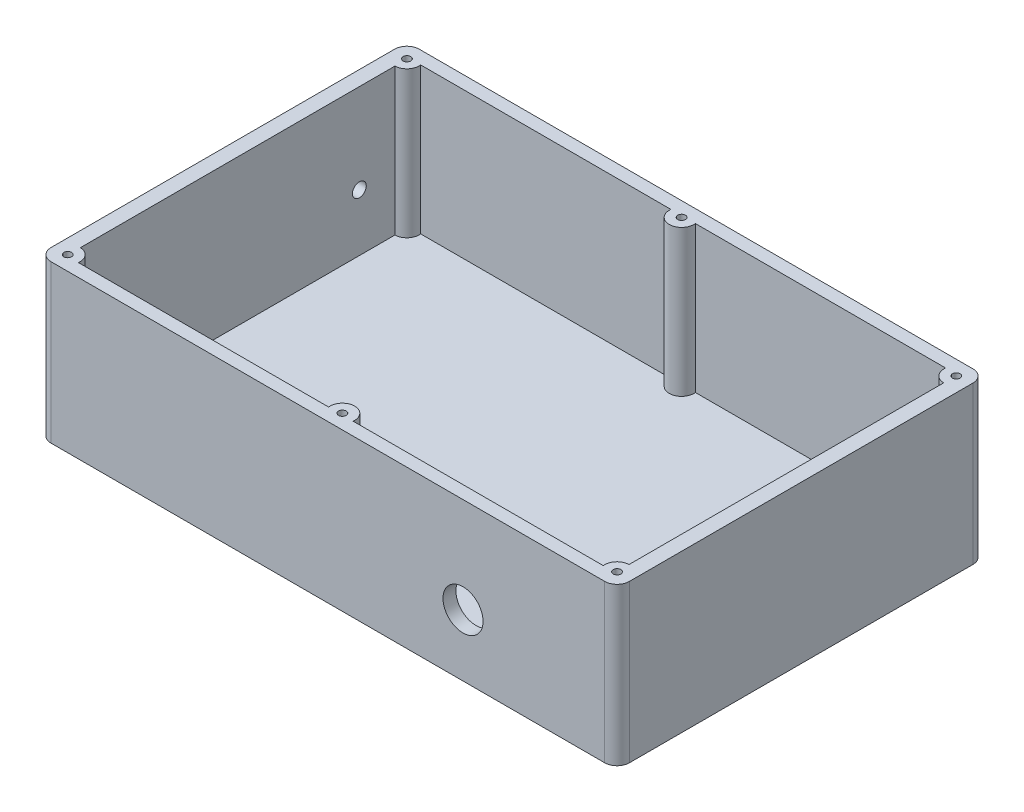
ISO-10303-21;
HEADER;
FILE_DESCRIPTION(('STEP AP214'),'2;1');
FILE_NAME('part.step','',(''),(''),'','','');
FILE_SCHEMA(('AUTOMOTIVE_DESIGN { 1 0 10303 214 1 1 1 1 }'));
ENDSEC;
DATA;
#1=APPLICATION_CONTEXT('core data for automotive mechanical design processes');
#2=APPLICATION_PROTOCOL_DEFINITION('international standard','automotive_design',2000,#1);
#3=PRODUCT_CONTEXT('',#1,'mechanical');
#4=PRODUCT('Part','Part','',(#3));
#5=PRODUCT_RELATED_PRODUCT_CATEGORY('part','',(#4));
#6=PRODUCT_DEFINITION_FORMATION('','',#4);
#7=PRODUCT_DEFINITION_CONTEXT('part definition',#1,'design');
#8=PRODUCT_DEFINITION('design','',#6,#7);
#9=PRODUCT_DEFINITION_SHAPE('','',#8);
#10=(LENGTH_UNIT() NAMED_UNIT(*) SI_UNIT(.MILLI.,.METRE.));
#11=(NAMED_UNIT(*) PLANE_ANGLE_UNIT() SI_UNIT($,.RADIAN.));
#12=(NAMED_UNIT(*) SI_UNIT($,.STERADIAN.) SOLID_ANGLE_UNIT());
#13=UNCERTAINTY_MEASURE_WITH_UNIT(LENGTH_MEASURE(1.E-05),#10,'distance_accuracy_value','');
#14=(GEOMETRIC_REPRESENTATION_CONTEXT(3) GLOBAL_UNCERTAINTY_ASSIGNED_CONTEXT((#13)) GLOBAL_UNIT_ASSIGNED_CONTEXT((#10,
#11,#12)) REPRESENTATION_CONTEXT('',''));
#15=CARTESIAN_POINT('',(0.,0.,0.));
#16=DIRECTION('',(0.,0.,1.));
#17=DIRECTION('',(1.,0.,0.));
#18=AXIS2_PLACEMENT_3D('',#15,#16,#17);
#19=CARTESIAN_POINT('',(-89.85,51.,55.75));
#20=DIRECTION('',(0.,-1.,0.));
#21=DIRECTION('',(0.,0.,-1.));
#22=AXIS2_PLACEMENT_3D('',#19,#20,#21);
#23=CYLINDRICAL_SURFACE('',#22,4.);
#24=CARTESIAN_POINT('',(-89.85,0.,55.75));
#25=DIRECTION('',(0.,1.,0.));
#26=DIRECTION('',(0.,0.,1.));
#27=AXIS2_PLACEMENT_3D('',#24,#25,#26);
#28=CIRCLE('',#27,4.);
#29=CARTESIAN_POINT('',(-93.85,0.,55.75));
#30=VERTEX_POINT('',#29);
#31=CARTESIAN_POINT('',(-89.85,0.,59.75));
#32=VERTEX_POINT('',#31);
#33=EDGE_CURVE('E141',#30,#32,#28,.T.);
#34=ORIENTED_EDGE('',*,*,#33,.T.);
#35=DIRECTION('',(0.,-1.,0.));
#36=VECTOR('',#35,1.);
#37=CARTESIAN_POINT('',(-89.85,51.,59.75));
#38=LINE('',#37,#36);
#39=CARTESIAN_POINT('',(-89.85,51.,59.75));
#40=VERTEX_POINT('',#39);
#41=EDGE_CURVE('E11',#40,#32,#38,.T.);
#42=ORIENTED_EDGE('',*,*,#41,.F.);
#43=CARTESIAN_POINT('',(-89.85,51.,55.75));
#44=DIRECTION('',(0.,1.,0.));
#45=DIRECTION('',(0.,0.,1.));
#46=AXIS2_PLACEMENT_3D('',#43,#44,#45);
#47=CIRCLE('',#46,4.);
#48=CARTESIAN_POINT('',(-93.85,51.,55.75));
#49=VERTEX_POINT('',#48);
#50=EDGE_CURVE('E157',#49,#40,#47,.T.);
#51=ORIENTED_EDGE('',*,*,#50,.F.);
#52=DIRECTION('',(0.,-1.,0.));
#53=VECTOR('',#52,1.);
#54=CARTESIAN_POINT('',(-93.85,51.,55.75));
#55=LINE('',#54,#53);
#56=EDGE_CURVE('E137',#49,#30,#55,.T.);
#57=ORIENTED_EDGE('',*,*,#56,.T.);
#58=EDGE_LOOP('',(#34,#42,#51,#57));
#59=FACE_BOUND('',#58,.T.);
#60=ADVANCED_FACE('F33',(#59),#23,.T.);
#61=CARTESIAN_POINT('',(-89.85,51.,59.75));
#62=DIRECTION('',(0.,0.,-1.));
#63=DIRECTION('',(-1.,0.,0.));
#64=AXIS2_PLACEMENT_3D('',#61,#62,#63);
#65=PLANE('',#64);
#66=CARTESIAN_POINT('',(43.85,20.,59.75));
#67=DIRECTION('',(0.,0.,1.));
#68=DIRECTION('',(1.,0.,0.));
#69=AXIS2_PLACEMENT_3D('',#66,#67,#68);
#70=CIRCLE('',#69,6.5);
#71=CARTESIAN_POINT('',(50.35,20.,59.75));
#72=VERTEX_POINT('',#71);
#73=EDGE_CURVE('E344',#72,#72,#70,.T.);
#74=ORIENTED_EDGE('',*,*,#73,.F.);
#75=EDGE_LOOP('',(#74));
#76=FACE_BOUND('',#75,.T.);
#77=DIRECTION('',(1.,0.,0.));
#78=VECTOR('',#77,1.);
#79=CARTESIAN_POINT('',(-89.85,0.,59.75));
#80=LINE('',#79,#78);
#81=CARTESIAN_POINT('',(89.85,0.,59.75));
#82=VERTEX_POINT('',#81);
#83=EDGE_CURVE('E144',#32,#82,#80,.T.);
#84=ORIENTED_EDGE('',*,*,#83,.T.);
#85=DIRECTION('',(0.,-1.,0.));
#86=VECTOR('',#85,1.);
#87=CARTESIAN_POINT('',(89.85,51.,59.75));
#88=LINE('',#87,#86);
#89=CARTESIAN_POINT('',(89.85,51.,59.75));
#90=VERTEX_POINT('',#89);
#91=EDGE_CURVE('E40',#90,#82,#88,.T.);
#92=ORIENTED_EDGE('',*,*,#91,.F.);
#93=DIRECTION('',(1.,0.,0.));
#94=VECTOR('',#93,1.);
#95=CARTESIAN_POINT('',(-89.85,51.,59.75));
#96=LINE('',#95,#94);
#97=EDGE_CURVE('E97',#40,#90,#96,.T.);
#98=ORIENTED_EDGE('',*,*,#97,.F.);
#99=ORIENTED_EDGE('',*,*,#41,.T.);
#100=EDGE_LOOP('',(#84,#92,#98,#99));
#101=FACE_BOUND('',#100,.T.);
#102=ADVANCED_FACE('F350',(#76,#101),#65,.F.);
#103=CARTESIAN_POINT('',(89.85,51.,55.75));
#104=DIRECTION('',(0.,-1.,0.));
#105=DIRECTION('',(0.,0.,-1.));
#106=AXIS2_PLACEMENT_3D('',#103,#104,#105);
#107=CYLINDRICAL_SURFACE('',#106,4.00000000000002);
#108=CARTESIAN_POINT('',(89.85,0.,55.75));
#109=DIRECTION('',(0.,1.,0.));
#110=DIRECTION('',(0.,0.,1.));
#111=AXIS2_PLACEMENT_3D('',#108,#109,#110);
#112=CIRCLE('',#111,4.00000000000002);
#113=CARTESIAN_POINT('',(93.85,0.,55.75));
#114=VERTEX_POINT('',#113);
#115=EDGE_CURVE('E147',#82,#114,#112,.T.);
#116=ORIENTED_EDGE('',*,*,#115,.T.);
#117=DIRECTION('',(0.,-1.,0.));
#118=VECTOR('',#117,1.);
#119=CARTESIAN_POINT('',(93.85,51.,55.75));
#120=LINE('',#119,#118);
#121=CARTESIAN_POINT('',(93.85,51.,55.75));
#122=VERTEX_POINT('',#121);
#123=EDGE_CURVE('E164',#122,#114,#120,.T.);
#124=ORIENTED_EDGE('',*,*,#123,.F.);
#125=CARTESIAN_POINT('',(89.85,51.,55.75));
#126=DIRECTION('',(0.,1.,0.));
#127=DIRECTION('',(0.,0.,1.));
#128=AXIS2_PLACEMENT_3D('',#125,#126,#127);
#129=CIRCLE('',#128,4.00000000000002);
#130=EDGE_CURVE('E172',#90,#122,#129,.T.);
#131=ORIENTED_EDGE('',*,*,#130,.F.);
#132=ORIENTED_EDGE('',*,*,#91,.T.);
#133=EDGE_LOOP('',(#116,#124,#131,#132));
#134=FACE_BOUND('',#133,.T.);
#135=ADVANCED_FACE('F170',(#134),#107,.T.);
#136=CARTESIAN_POINT('',(93.85,51.,-55.75));
#137=DIRECTION('',(-1.,0.,0.));
#138=DIRECTION('',(0.,0.,1.));
#139=AXIS2_PLACEMENT_3D('',#136,#137,#138);
#140=PLANE('',#139);
#141=DIRECTION('',(0.,0.,-1.));
#142=VECTOR('',#141,1.);
#143=CARTESIAN_POINT('',(93.85,0.,-55.75));
#144=LINE('',#143,#142);
#145=CARTESIAN_POINT('',(93.85,0.,-55.75));
#146=VERTEX_POINT('',#145);
#147=EDGE_CURVE('E149',#114,#146,#144,.T.);
#148=ORIENTED_EDGE('',*,*,#147,.T.);
#149=DIRECTION('',(0.,-1.,0.));
#150=VECTOR('',#149,1.);
#151=CARTESIAN_POINT('',(93.85,51.,-55.75));
#152=LINE('',#151,#150);
#153=CARTESIAN_POINT('',(93.85,51.,-55.75));
#154=VERTEX_POINT('',#153);
#155=EDGE_CURVE('E161',#154,#146,#152,.T.);
#156=ORIENTED_EDGE('',*,*,#155,.F.);
#157=DIRECTION('',(0.,0.,-1.));
#158=VECTOR('',#157,1.);
#159=CARTESIAN_POINT('',(93.85,51.,-55.75));
#160=LINE('',#159,#158);
#161=EDGE_CURVE('E184',#122,#154,#160,.T.);
#162=ORIENTED_EDGE('',*,*,#161,.F.);
#163=ORIENTED_EDGE('',*,*,#123,.T.);
#164=EDGE_LOOP('',(#148,#156,#162,#163));
#165=FACE_BOUND('',#164,.T.);
#166=ADVANCED_FACE('F180',(#165),#140,.F.);
#167=CARTESIAN_POINT('',(89.85,51.,-55.75));
#168=DIRECTION('',(0.,-1.,0.));
#169=DIRECTION('',(0.,0.,-1.));
#170=AXIS2_PLACEMENT_3D('',#167,#168,#169);
#171=CYLINDRICAL_SURFACE('',#170,4.00000000000001);
#172=CARTESIAN_POINT('',(89.85,0.,-55.75));
#173=DIRECTION('',(0.,1.,0.));
#174=DIRECTION('',(0.,0.,1.));
#175=AXIS2_PLACEMENT_3D('',#172,#173,#174);
#176=CIRCLE('',#175,4.00000000000001);
#177=CARTESIAN_POINT('',(89.85,0.,-59.75));
#178=VERTEX_POINT('',#177);
#179=EDGE_CURVE('E151',#146,#178,#176,.T.);
#180=ORIENTED_EDGE('',*,*,#179,.T.);
#181=DIRECTION('',(0.,-1.,0.));
#182=VECTOR('',#181,1.);
#183=CARTESIAN_POINT('',(89.85,51.,-59.75));
#184=LINE('',#183,#182);
#185=CARTESIAN_POINT('',(89.85,51.,-59.75));
#186=VERTEX_POINT('',#185);
#187=EDGE_CURVE('E132',#186,#178,#184,.T.);
#188=ORIENTED_EDGE('',*,*,#187,.F.);
#189=CARTESIAN_POINT('',(89.85,51.,-55.75));
#190=DIRECTION('',(0.,1.,0.));
#191=DIRECTION('',(0.,0.,1.));
#192=AXIS2_PLACEMENT_3D('',#189,#190,#191);
#193=CIRCLE('',#192,4.00000000000001);
#194=EDGE_CURVE('E120',#154,#186,#193,.T.);
#195=ORIENTED_EDGE('',*,*,#194,.F.);
#196=ORIENTED_EDGE('',*,*,#155,.T.);
#197=EDGE_LOOP('',(#180,#188,#195,#196));
#198=FACE_BOUND('',#197,.T.);
#199=ADVANCED_FACE('F183',(#198),#171,.T.);
#200=CARTESIAN_POINT('',(-89.85,51.,-59.75));
#201=DIRECTION('',(0.,0.,1.));
#202=DIRECTION('',(1.,0.,0.));
#203=AXIS2_PLACEMENT_3D('',#200,#201,#202);
#204=PLANE('',#203);
#205=DIRECTION('',(-1.,0.,0.));
#206=VECTOR('',#205,1.);
#207=CARTESIAN_POINT('',(-89.85,0.,-59.75));
#208=LINE('',#207,#206);
#209=CARTESIAN_POINT('',(-89.85,0.,-59.75));
#210=VERTEX_POINT('',#209);
#211=EDGE_CURVE('E129',#178,#210,#208,.T.);
#212=ORIENTED_EDGE('',*,*,#211,.T.);
#213=DIRECTION('',(0.,-1.,0.));
#214=VECTOR('',#213,1.);
#215=CARTESIAN_POINT('',(-89.85,51.,-59.75));
#216=LINE('',#215,#214);
#217=CARTESIAN_POINT('',(-89.85,51.,-59.75));
#218=VERTEX_POINT('',#217);
#219=EDGE_CURVE('E126',#218,#210,#216,.T.);
#220=ORIENTED_EDGE('',*,*,#219,.F.);
#221=DIRECTION('',(-1.,0.,0.));
#222=VECTOR('',#221,1.);
#223=CARTESIAN_POINT('',(-89.85,51.,-59.75));
#224=LINE('',#223,#222);
#225=EDGE_CURVE('E113',#186,#218,#224,.T.);
#226=ORIENTED_EDGE('',*,*,#225,.F.);
#227=ORIENTED_EDGE('',*,*,#187,.T.);
#228=EDGE_LOOP('',(#212,#220,#226,#227));
#229=FACE_BOUND('',#228,.T.);
#230=ADVANCED_FACE('F127',(#229),#204,.F.);
#231=CARTESIAN_POINT('',(-89.85,51.,-55.75));
#232=DIRECTION('',(0.,-1.,0.));
#233=DIRECTION('',(0.,0.,-1.));
#234=AXIS2_PLACEMENT_3D('',#231,#232,#233);
#235=CYLINDRICAL_SURFACE('',#234,4.);
#236=CARTESIAN_POINT('',(-89.85,0.,-55.75));
#237=DIRECTION('',(0.,1.,0.));
#238=DIRECTION('',(0.,0.,1.));
#239=AXIS2_PLACEMENT_3D('',#236,#237,#238);
#240=CIRCLE('',#239,4.);
#241=CARTESIAN_POINT('',(-93.85,0.,-55.75));
#242=VERTEX_POINT('',#241);
#243=EDGE_CURVE('E154',#210,#242,#240,.T.);
#244=ORIENTED_EDGE('',*,*,#243,.T.);
#245=DIRECTION('',(0.,-1.,0.));
#246=VECTOR('',#245,1.);
#247=CARTESIAN_POINT('',(-93.85,51.,-55.75));
#248=LINE('',#247,#246);
#249=CARTESIAN_POINT('',(-93.85,51.,-55.75));
#250=VERTEX_POINT('',#249);
#251=EDGE_CURVE('E133',#250,#242,#248,.T.);
#252=ORIENTED_EDGE('',*,*,#251,.F.);
#253=CARTESIAN_POINT('',(-89.85,51.,-55.75));
#254=DIRECTION('',(0.,1.,0.));
#255=DIRECTION('',(0.,0.,1.));
#256=AXIS2_PLACEMENT_3D('',#253,#254,#255);
#257=CIRCLE('',#256,4.);
#258=EDGE_CURVE('E117',#218,#250,#257,.T.);
#259=ORIENTED_EDGE('',*,*,#258,.F.);
#260=ORIENTED_EDGE('',*,*,#219,.T.);
#261=EDGE_LOOP('',(#244,#252,#259,#260));
#262=FACE_BOUND('',#261,.T.);
#263=ADVANCED_FACE('F135',(#262),#235,.T.);
#264=CARTESIAN_POINT('',(-93.85,51.,-55.75));
#265=DIRECTION('',(1.,0.,0.));
#266=DIRECTION('',(0.,0.,-1.));
#267=AXIS2_PLACEMENT_3D('',#264,#265,#266);
#268=PLANE('',#267);
#269=CARTESIAN_POINT('',(-93.85,22.,-39.5));
#270=DIRECTION('',(-1.,0.,0.));
#271=DIRECTION('',(0.,0.,1.));
#272=AXIS2_PLACEMENT_3D('',#269,#270,#271);
#273=CIRCLE('',#272,2.24999999999999);
#274=CARTESIAN_POINT('',(-93.85,22.,-37.25));
#275=VERTEX_POINT('',#274);
#276=EDGE_CURVE('E338',#275,#275,#273,.T.);
#277=ORIENTED_EDGE('',*,*,#276,.F.);
#278=EDGE_LOOP('',(#277));
#279=FACE_BOUND('',#278,.T.);
#280=CARTESIAN_POINT('',(-93.85,22.,39.5));
#281=DIRECTION('',(-1.,0.,0.));
#282=DIRECTION('',(0.,0.,1.));
#283=AXIS2_PLACEMENT_3D('',#280,#281,#282);
#284=CIRCLE('',#283,2.24999999999999);
#285=CARTESIAN_POINT('',(-93.85,22.,41.75));
#286=VERTEX_POINT('',#285);
#287=EDGE_CURVE('E332',#286,#286,#284,.T.);
#288=ORIENTED_EDGE('',*,*,#287,.F.);
#289=EDGE_LOOP('',(#288));
#290=FACE_BOUND('',#289,.T.);
#291=DIRECTION('',(0.,0.,1.));
#292=VECTOR('',#291,1.);
#293=CARTESIAN_POINT('',(-93.85,0.,-55.75));
#294=LINE('',#293,#292);
#295=EDGE_CURVE('E89',#242,#30,#294,.T.);
#296=ORIENTED_EDGE('',*,*,#295,.T.);
#297=ORIENTED_EDGE('',*,*,#56,.F.);
#298=DIRECTION('',(0.,0.,1.));
#299=VECTOR('',#298,1.);
#300=CARTESIAN_POINT('',(-93.85,51.,-55.75));
#301=LINE('',#300,#299);
#302=EDGE_CURVE('E56',#250,#49,#301,.T.);
#303=ORIENTED_EDGE('',*,*,#302,.F.);
#304=ORIENTED_EDGE('',*,*,#251,.T.);
#305=EDGE_LOOP('',(#296,#297,#303,#304));
#306=FACE_BOUND('',#305,.T.);
#307=ADVANCED_FACE('F355',(#279,#290,#306),#268,.F.);
#308=CARTESIAN_POINT('',(-89.85,51.,55.75));
#309=DIRECTION('',(0.,1.,0.));
#310=DIRECTION('',(0.,0.,1.));
#311=AXIS2_PLACEMENT_3D('',#308,#309,#310);
#312=PLANE('',#311);
#313=CARTESIAN_POINT('',(-89.15,51.,-55.05));
#314=DIRECTION('',(0.,1.,0.));
#315=DIRECTION('',(0.,0.,1.));
#316=AXIS2_PLACEMENT_3D('',#313,#314,#315);
#317=CIRCLE('',#316,1.24999999999999);
#318=CARTESIAN_POINT('',(-89.15,51.,-53.8));
#319=VERTEX_POINT('',#318);
#320=EDGE_CURVE('E326',#319,#319,#317,.T.);
#321=ORIENTED_EDGE('',*,*,#320,.F.);
#322=EDGE_LOOP('',(#321));
#323=FACE_BOUND('',#322,.T.);
#324=CARTESIAN_POINT('',(-89.15,51.,55.05));
#325=DIRECTION('',(0.,1.,0.));
#326=DIRECTION('',(0.,0.,1.));
#327=AXIS2_PLACEMENT_3D('',#324,#325,#326);
#328=CIRCLE('',#327,1.24999999999999);
#329=CARTESIAN_POINT('',(-89.15,51.,56.3));
#330=VERTEX_POINT('',#329);
#331=EDGE_CURVE('E320',#330,#330,#328,.T.);
#332=ORIENTED_EDGE('',*,*,#331,.F.);
#333=EDGE_LOOP('',(#332));
#334=FACE_BOUND('',#333,.T.);
#335=CARTESIAN_POINT('',(89.1500000000001,51.,55.05));
#336=DIRECTION('',(0.,1.,0.));
#337=DIRECTION('',(0.,0.,1.));
#338=AXIS2_PLACEMENT_3D('',#335,#336,#337);
#339=CIRCLE('',#338,1.24999999999999);
#340=CARTESIAN_POINT('',(89.1500000000001,51.,56.3));
#341=VERTEX_POINT('',#340);
#342=EDGE_CURVE('E314',#341,#341,#339,.T.);
#343=ORIENTED_EDGE('',*,*,#342,.F.);
#344=EDGE_LOOP('',(#343));
#345=FACE_BOUND('',#344,.T.);
#346=CARTESIAN_POINT('',(89.15,51.,-55.05));
#347=DIRECTION('',(0.,1.,0.));
#348=DIRECTION('',(0.,0.,1.));
#349=AXIS2_PLACEMENT_3D('',#346,#347,#348);
#350=CIRCLE('',#349,1.24999999999999);
#351=CARTESIAN_POINT('',(89.15,51.,-53.8000000000001));
#352=VERTEX_POINT('',#351);
#353=EDGE_CURVE('E308',#352,#352,#350,.T.);
#354=ORIENTED_EDGE('',*,*,#353,.F.);
#355=EDGE_LOOP('',(#354));
#356=FACE_BOUND('',#355,.T.);
#357=CARTESIAN_POINT('',(0.,51.,55.05));
#358=DIRECTION('',(0.,1.,0.));
#359=DIRECTION('',(0.,0.,1.));
#360=AXIS2_PLACEMENT_3D('',#357,#358,#359);
#361=CIRCLE('',#360,1.24999999999999);
#362=CARTESIAN_POINT('',(0.,51.,56.3));
#363=VERTEX_POINT('',#362);
#364=EDGE_CURVE('E302',#363,#363,#361,.T.);
#365=ORIENTED_EDGE('',*,*,#364,.F.);
#366=EDGE_LOOP('',(#365));
#367=FACE_BOUND('',#366,.T.);
#368=CARTESIAN_POINT('',(0.,51.,-55.05));
#369=DIRECTION('',(0.,1.,0.));
#370=DIRECTION('',(0.,0.,1.));
#371=AXIS2_PLACEMENT_3D('',#368,#369,#370);
#372=CIRCLE('',#371,1.24999999999999);
#373=CARTESIAN_POINT('',(0.,51.,-53.8));
#374=VERTEX_POINT('',#373);
#375=EDGE_CURVE('E296',#374,#374,#372,.T.);
#376=ORIENTED_EDGE('',*,*,#375,.F.);
#377=EDGE_LOOP('',(#376));
#378=FACE_BOUND('',#377,.T.);
#379=CARTESIAN_POINT('',(-89.15,51.,-55.05));
#380=DIRECTION('',(0.,-1.,0.));
#381=DIRECTION('',(0.,0.,-1.));
#382=AXIS2_PLACEMENT_3D('',#379,#380,#381);
#383=CIRCLE('',#382,4.);
#384=CARTESIAN_POINT('',(-85.1813730334031,51.,-55.55));
#385=VERTEX_POINT('',#384);
#386=CARTESIAN_POINT('',(-89.05,51.,-51.0512501953736));
#387=VERTEX_POINT('',#386);
#388=EDGE_CURVE('E47',#385,#387,#383,.T.);
#389=ORIENTED_EDGE('',*,*,#388,.F.);
#390=DIRECTION('',(-1.,0.,0.));
#391=VECTOR('',#390,1.);
#392=CARTESIAN_POINT('',(-3.96862696659687,51.,-55.55));
#393=LINE('',#392,#391);
#394=CARTESIAN_POINT('',(-3.96862696659687,51.,-55.55));
#395=VERTEX_POINT('',#394);
#396=EDGE_CURVE('E224',#395,#385,#393,.T.);
#397=ORIENTED_EDGE('',*,*,#396,.F.);
#398=CARTESIAN_POINT('',(0.,51.,-55.05));
#399=DIRECTION('',(0.,-1.,0.));
#400=DIRECTION('',(0.,0.,1.));
#401=AXIS2_PLACEMENT_3D('',#398,#399,#400);
#402=CIRCLE('',#401,4.);
#403=CARTESIAN_POINT('',(3.9686269665969,51.,-55.55));
#404=VERTEX_POINT('',#403);
#405=EDGE_CURVE('E228',#404,#395,#402,.T.);
#406=ORIENTED_EDGE('',*,*,#405,.F.);
#407=DIRECTION('',(-1.,0.,0.));
#408=VECTOR('',#407,1.);
#409=CARTESIAN_POINT('',(3.9686269665969,51.,-55.55));
#410=LINE('',#409,#408);
#411=CARTESIAN_POINT('',(85.1813730334031,51.,-55.55));
#412=VERTEX_POINT('',#411);
#413=EDGE_CURVE('E231',#412,#404,#410,.T.);
#414=ORIENTED_EDGE('',*,*,#413,.F.);
#415=CARTESIAN_POINT('',(89.15,51.,-55.05));
#416=DIRECTION('',(0.,-1.,0.));
#417=DIRECTION('',(0.,0.,1.));
#418=AXIS2_PLACEMENT_3D('',#415,#416,#417);
#419=CIRCLE('',#418,4.);
#420=CARTESIAN_POINT('',(89.05,51.,-51.0512501953736));
#421=VERTEX_POINT('',#420);
#422=EDGE_CURVE('E234',#421,#412,#419,.T.);
#423=ORIENTED_EDGE('',*,*,#422,.F.);
#424=DIRECTION('',(0.,0.,-1.));
#425=VECTOR('',#424,1.);
#426=CARTESIAN_POINT('',(89.05,51.,51.0512501953735));
#427=LINE('',#426,#425);
#428=CARTESIAN_POINT('',(89.05,51.,51.0512501953735));
#429=VERTEX_POINT('',#428);
#430=EDGE_CURVE('E237',#429,#421,#427,.T.);
#431=ORIENTED_EDGE('',*,*,#430,.F.);
#432=CARTESIAN_POINT('',(89.1500000000001,51.,55.05));
#433=DIRECTION('',(0.,-1.,0.));
#434=DIRECTION('',(0.,0.,-1.));
#435=AXIS2_PLACEMENT_3D('',#432,#433,#434);
#436=CIRCLE('',#435,4.);
#437=CARTESIAN_POINT('',(85.1813730334032,51.,55.55));
#438=VERTEX_POINT('',#437);
#439=EDGE_CURVE('E240',#438,#429,#436,.T.);
#440=ORIENTED_EDGE('',*,*,#439,.F.);
#441=DIRECTION('',(1.,0.,0.));
#442=VECTOR('',#441,1.);
#443=CARTESIAN_POINT('',(3.96862696659693,51.,55.55));
#444=LINE('',#443,#442);
#445=CARTESIAN_POINT('',(3.96862696659693,51.,55.55));
#446=VERTEX_POINT('',#445);
#447=EDGE_CURVE('E243',#446,#438,#444,.T.);
#448=ORIENTED_EDGE('',*,*,#447,.F.);
#449=CARTESIAN_POINT('',(0.,51.,55.05));
#450=DIRECTION('',(0.,-1.,0.));
#451=DIRECTION('',(0.,0.,-1.));
#452=AXIS2_PLACEMENT_3D('',#449,#450,#451);
#453=CIRCLE('',#452,4.);
#454=CARTESIAN_POINT('',(-3.96862696659685,51.,55.55));
#455=VERTEX_POINT('',#454);
#456=EDGE_CURVE('E246',#455,#446,#453,.T.);
#457=ORIENTED_EDGE('',*,*,#456,.F.);
#458=DIRECTION('',(1.,0.,0.));
#459=VECTOR('',#458,1.);
#460=CARTESIAN_POINT('',(-85.1813730334031,51.,55.55));
#461=LINE('',#460,#459);
#462=CARTESIAN_POINT('',(-85.1813730334031,51.,55.55));
#463=VERTEX_POINT('',#462);
#464=EDGE_CURVE('E249',#463,#455,#461,.T.);
#465=ORIENTED_EDGE('',*,*,#464,.F.);
#466=CARTESIAN_POINT('',(-89.15,51.,55.05));
#467=DIRECTION('',(0.,-1.,0.));
#468=DIRECTION('',(0.,0.,1.));
#469=AXIS2_PLACEMENT_3D('',#466,#467,#468);
#470=CIRCLE('',#469,4.);
#471=CARTESIAN_POINT('',(-89.05,51.,51.0512501953736));
#472=VERTEX_POINT('',#471);
#473=EDGE_CURVE('E252',#472,#463,#470,.T.);
#474=ORIENTED_EDGE('',*,*,#473,.F.);
#475=DIRECTION('',(0.,0.,1.));
#476=VECTOR('',#475,1.);
#477=CARTESIAN_POINT('',(-89.05,51.,-51.0512501953736));
#478=LINE('',#477,#476);
#479=EDGE_CURVE('E255',#387,#472,#478,.T.);
#480=ORIENTED_EDGE('',*,*,#479,.F.);
#481=EDGE_LOOP('',(#389,#397,#406,#414,#423,#431,#440,#448,#457,#465,#474,#480));
#482=FACE_BOUND('',#481,.T.);
#483=ORIENTED_EDGE('',*,*,#50,.T.);
#484=ORIENTED_EDGE('',*,*,#97,.T.);
#485=ORIENTED_EDGE('',*,*,#130,.T.);
#486=ORIENTED_EDGE('',*,*,#161,.T.);
#487=ORIENTED_EDGE('',*,*,#194,.T.);
#488=ORIENTED_EDGE('',*,*,#225,.T.);
#489=ORIENTED_EDGE('',*,*,#258,.T.);
#490=ORIENTED_EDGE('',*,*,#302,.T.);
#491=EDGE_LOOP('',(#483,#484,#485,#486,#487,#488,#489,#490));
#492=FACE_BOUND('',#491,.T.);
#493=ADVANCED_FACE('F115',(#323,#334,#345,#356,#367,#378,#482,#492),#312,.T.);
#494=CARTESIAN_POINT('',(-89.85,0.,55.75));
#495=DIRECTION('',(0.,1.,0.));
#496=DIRECTION('',(0.,0.,1.));
#497=AXIS2_PLACEMENT_3D('',#494,#495,#496);
#498=PLANE('',#497);
#499=ORIENTED_EDGE('',*,*,#33,.F.);
#500=ORIENTED_EDGE('',*,*,#295,.F.);
#501=ORIENTED_EDGE('',*,*,#243,.F.);
#502=ORIENTED_EDGE('',*,*,#211,.F.);
#503=ORIENTED_EDGE('',*,*,#179,.F.);
#504=ORIENTED_EDGE('',*,*,#147,.F.);
#505=ORIENTED_EDGE('',*,*,#115,.F.);
#506=ORIENTED_EDGE('',*,*,#83,.F.);
#507=EDGE_LOOP('',(#499,#500,#501,#502,#503,#504,#505,#506));
#508=FACE_BOUND('',#507,.T.);
#509=ADVANCED_FACE('F176',(#508),#498,.F.);
#510=CARTESIAN_POINT('',(-89.15,3.5,-55.05));
#511=DIRECTION('',(0.,1.,0.));
#512=DIRECTION('',(0.,0.,1.));
#513=AXIS2_PLACEMENT_3D('',#510,#511,#512);
#514=CYLINDRICAL_SURFACE('',#513,4.);
#515=ORIENTED_EDGE('',*,*,#388,.T.);
#516=DIRECTION('',(0.,1.,0.));
#517=VECTOR('',#516,1.);
#518=CARTESIAN_POINT('',(-89.05,3.5,-51.0512501953736));
#519=LINE('',#518,#517);
#520=CARTESIAN_POINT('',(-89.05,3.5,-51.0512501953736));
#521=VERTEX_POINT('',#520);
#522=EDGE_CURVE('E190',#521,#387,#519,.T.);
#523=ORIENTED_EDGE('',*,*,#522,.F.);
#524=CARTESIAN_POINT('',(-89.15,3.5,-55.05));
#525=DIRECTION('',(0.,-1.,0.));
#526=DIRECTION('',(0.,0.,-1.));
#527=AXIS2_PLACEMENT_3D('',#524,#525,#526);
#528=CIRCLE('',#527,4.);
#529=CARTESIAN_POINT('',(-85.1813730334031,3.5,-55.55));
#530=VERTEX_POINT('',#529);
#531=EDGE_CURVE('E227',#530,#521,#528,.T.);
#532=ORIENTED_EDGE('',*,*,#531,.F.);
#533=DIRECTION('',(0.,1.,0.));
#534=VECTOR('',#533,1.);
#535=CARTESIAN_POINT('',(-85.1813730334031,3.5,-55.55));
#536=LINE('',#535,#534);
#537=EDGE_CURVE('E145',#530,#385,#536,.T.);
#538=ORIENTED_EDGE('',*,*,#537,.T.);
#539=EDGE_LOOP('',(#515,#523,#532,#538));
#540=FACE_BOUND('',#539,.T.);
#541=ADVANCED_FACE('F416',(#540),#514,.T.);
#542=CARTESIAN_POINT('',(-3.96862696659687,3.5,-55.55));
#543=DIRECTION('',(0.,0.,-1.));
#544=DIRECTION('',(-1.,0.,0.));
#545=AXIS2_PLACEMENT_3D('',#542,#543,#544);
#546=PLANE('',#545);
#547=ORIENTED_EDGE('',*,*,#396,.T.);
#548=ORIENTED_EDGE('',*,*,#537,.F.);
#549=DIRECTION('',(-1.,0.,0.));
#550=VECTOR('',#549,1.);
#551=CARTESIAN_POINT('',(-3.96862696659687,3.5,-55.55));
#552=LINE('',#551,#550);
#553=CARTESIAN_POINT('',(-3.96862696659687,3.5,-55.55));
#554=VERTEX_POINT('',#553);
#555=EDGE_CURVE('E193',#554,#530,#552,.T.);
#556=ORIENTED_EDGE('',*,*,#555,.F.);
#557=DIRECTION('',(0.,1.,0.));
#558=VECTOR('',#557,1.);
#559=CARTESIAN_POINT('',(-3.96862696659687,3.5,-55.55));
#560=LINE('',#559,#558);
#561=EDGE_CURVE('E220',#554,#395,#560,.T.);
#562=ORIENTED_EDGE('',*,*,#561,.T.);
#563=EDGE_LOOP('',(#547,#548,#556,#562));
#564=FACE_BOUND('',#563,.T.);
#565=ADVANCED_FACE('F425',(#564),#546,.F.);
#566=CARTESIAN_POINT('',(0.,3.5,-55.05));
#567=DIRECTION('',(0.,1.,0.));
#568=DIRECTION('',(0.,0.,1.));
#569=AXIS2_PLACEMENT_3D('',#566,#567,#568);
#570=CYLINDRICAL_SURFACE('',#569,4.);
#571=ORIENTED_EDGE('',*,*,#405,.T.);
#572=ORIENTED_EDGE('',*,*,#561,.F.);
#573=CARTESIAN_POINT('',(0.,3.5,-55.05));
#574=DIRECTION('',(0.,-1.,0.));
#575=DIRECTION('',(0.,0.,1.));
#576=AXIS2_PLACEMENT_3D('',#573,#574,#575);
#577=CIRCLE('',#576,4.);
#578=CARTESIAN_POINT('',(3.9686269665969,3.5,-55.55));
#579=VERTEX_POINT('',#578);
#580=EDGE_CURVE('E262',#579,#554,#577,.T.);
#581=ORIENTED_EDGE('',*,*,#580,.F.);
#582=DIRECTION('',(0.,1.,0.));
#583=VECTOR('',#582,1.);
#584=CARTESIAN_POINT('',(3.9686269665969,3.5,-55.55));
#585=LINE('',#584,#583);
#586=EDGE_CURVE('E217',#579,#404,#585,.T.);
#587=ORIENTED_EDGE('',*,*,#586,.T.);
#588=EDGE_LOOP('',(#571,#572,#581,#587));
#589=FACE_BOUND('',#588,.T.);
#590=ADVANCED_FACE('F434',(#589),#570,.T.);
#591=CARTESIAN_POINT('',(3.9686269665969,3.5,-55.55));
#592=DIRECTION('',(0.,0.,-1.));
#593=DIRECTION('',(-1.,0.,0.));
#594=AXIS2_PLACEMENT_3D('',#591,#592,#593);
#595=PLANE('',#594);
#596=ORIENTED_EDGE('',*,*,#413,.T.);
#597=ORIENTED_EDGE('',*,*,#586,.F.);
#598=DIRECTION('',(-1.,0.,0.));
#599=VECTOR('',#598,1.);
#600=CARTESIAN_POINT('',(3.9686269665969,3.5,-55.55));
#601=LINE('',#600,#599);
#602=CARTESIAN_POINT('',(85.1813730334031,3.5,-55.55));
#603=VERTEX_POINT('',#602);
#604=EDGE_CURVE('E265',#603,#579,#601,.T.);
#605=ORIENTED_EDGE('',*,*,#604,.F.);
#606=DIRECTION('',(0.,1.,0.));
#607=VECTOR('',#606,1.);
#608=CARTESIAN_POINT('',(85.1813730334031,3.5,-55.55));
#609=LINE('',#608,#607);
#610=EDGE_CURVE('E214',#603,#412,#609,.T.);
#611=ORIENTED_EDGE('',*,*,#610,.T.);
#612=EDGE_LOOP('',(#596,#597,#605,#611));
#613=FACE_BOUND('',#612,.T.);
#614=ADVANCED_FACE('F444',(#613),#595,.F.);
#615=CARTESIAN_POINT('',(89.15,3.5,-55.05));
#616=DIRECTION('',(0.,1.,0.));
#617=DIRECTION('',(0.,0.,1.));
#618=AXIS2_PLACEMENT_3D('',#615,#616,#617);
#619=CYLINDRICAL_SURFACE('',#618,4.);
#620=ORIENTED_EDGE('',*,*,#422,.T.);
#621=ORIENTED_EDGE('',*,*,#610,.F.);
#622=CARTESIAN_POINT('',(89.15,3.5,-55.05));
#623=DIRECTION('',(0.,-1.,0.));
#624=DIRECTION('',(0.,0.,1.));
#625=AXIS2_PLACEMENT_3D('',#622,#623,#624);
#626=CIRCLE('',#625,4.);
#627=CARTESIAN_POINT('',(89.05,3.5,-51.0512501953736));
#628=VERTEX_POINT('',#627);
#629=EDGE_CURVE('E268',#628,#603,#626,.T.);
#630=ORIENTED_EDGE('',*,*,#629,.F.);
#631=DIRECTION('',(0.,1.,0.));
#632=VECTOR('',#631,1.);
#633=CARTESIAN_POINT('',(89.05,3.5,-51.0512501953736));
#634=LINE('',#633,#632);
#635=EDGE_CURVE('E211',#628,#421,#634,.T.);
#636=ORIENTED_EDGE('',*,*,#635,.T.);
#637=EDGE_LOOP('',(#620,#621,#630,#636));
#638=FACE_BOUND('',#637,.T.);
#639=ADVANCED_FACE('F454',(#638),#619,.T.);
#640=CARTESIAN_POINT('',(89.05,3.5,51.0512501953735));
#641=DIRECTION('',(1.,0.,0.));
#642=DIRECTION('',(0.,0.,-1.));
#643=AXIS2_PLACEMENT_3D('',#640,#641,#642);
#644=PLANE('',#643);
#645=ORIENTED_EDGE('',*,*,#430,.T.);
#646=ORIENTED_EDGE('',*,*,#635,.F.);
#647=DIRECTION('',(0.,0.,-1.));
#648=VECTOR('',#647,1.);
#649=CARTESIAN_POINT('',(89.05,3.5,51.0512501953735));
#650=LINE('',#649,#648);
#651=CARTESIAN_POINT('',(89.05,3.5,51.0512501953735));
#652=VERTEX_POINT('',#651);
#653=EDGE_CURVE('E271',#652,#628,#650,.T.);
#654=ORIENTED_EDGE('',*,*,#653,.F.);
#655=DIRECTION('',(0.,1.,0.));
#656=VECTOR('',#655,1.);
#657=CARTESIAN_POINT('',(89.05,3.5,51.0512501953735));
#658=LINE('',#657,#656);
#659=EDGE_CURVE('E208',#652,#429,#658,.T.);
#660=ORIENTED_EDGE('',*,*,#659,.T.);
#661=EDGE_LOOP('',(#645,#646,#654,#660));
#662=FACE_BOUND('',#661,.T.);
#663=ADVANCED_FACE('F464',(#662),#644,.F.);
#664=CARTESIAN_POINT('',(89.1500000000001,3.5,55.05));
#665=DIRECTION('',(0.,1.,0.));
#666=DIRECTION('',(0.,0.,1.));
#667=AXIS2_PLACEMENT_3D('',#664,#665,#666);
#668=CYLINDRICAL_SURFACE('',#667,4.);
#669=ORIENTED_EDGE('',*,*,#439,.T.);
#670=ORIENTED_EDGE('',*,*,#659,.F.);
#671=CARTESIAN_POINT('',(89.1500000000001,3.5,55.05));
#672=DIRECTION('',(0.,-1.,0.));
#673=DIRECTION('',(0.,0.,-1.));
#674=AXIS2_PLACEMENT_3D('',#671,#672,#673);
#675=CIRCLE('',#674,4.);
#676=CARTESIAN_POINT('',(85.1813730334032,3.5,55.55));
#677=VERTEX_POINT('',#676);
#678=EDGE_CURVE('E274',#677,#652,#675,.T.);
#679=ORIENTED_EDGE('',*,*,#678,.F.);
#680=DIRECTION('',(0.,1.,0.));
#681=VECTOR('',#680,1.);
#682=CARTESIAN_POINT('',(85.1813730334032,3.5,55.55));
#683=LINE('',#682,#681);
#684=EDGE_CURVE('E205',#677,#438,#683,.T.);
#685=ORIENTED_EDGE('',*,*,#684,.T.);
#686=EDGE_LOOP('',(#669,#670,#679,#685));
#687=FACE_BOUND('',#686,.T.);
#688=ADVANCED_FACE('F474',(#687),#668,.T.);
#689=CARTESIAN_POINT('',(3.96862696659693,3.5,55.55));
#690=DIRECTION('',(0.,0.,1.));
#691=DIRECTION('',(1.,0.,0.));
#692=AXIS2_PLACEMENT_3D('',#689,#690,#691);
#693=PLANE('',#692);
#694=CARTESIAN_POINT('',(43.85,20.,55.55));
#695=DIRECTION('',(0.,0.,1.));
#696=DIRECTION('',(1.,0.,0.));
#697=AXIS2_PLACEMENT_3D('',#694,#695,#696);
#698=CIRCLE('',#697,6.5);
#699=CARTESIAN_POINT('',(50.35,20.,55.55));
#700=VERTEX_POINT('',#699);
#701=EDGE_CURVE('E341',#700,#700,#698,.T.);
#702=ORIENTED_EDGE('',*,*,#701,.T.);
#703=EDGE_LOOP('',(#702));
#704=FACE_BOUND('',#703,.T.);
#705=ORIENTED_EDGE('',*,*,#447,.T.);
#706=ORIENTED_EDGE('',*,*,#684,.F.);
#707=DIRECTION('',(1.,0.,0.));
#708=VECTOR('',#707,1.);
#709=CARTESIAN_POINT('',(3.96862696659693,3.5,55.55));
#710=LINE('',#709,#708);
#711=CARTESIAN_POINT('',(3.96862696659693,3.5,55.55));
#712=VERTEX_POINT('',#711);
#713=EDGE_CURVE('E277',#712,#677,#710,.T.);
#714=ORIENTED_EDGE('',*,*,#713,.F.);
#715=DIRECTION('',(0.,1.,0.));
#716=VECTOR('',#715,1.);
#717=CARTESIAN_POINT('',(3.96862696659693,3.5,55.55));
#718=LINE('',#717,#716);
#719=EDGE_CURVE('E202',#712,#446,#718,.T.);
#720=ORIENTED_EDGE('',*,*,#719,.T.);
#721=EDGE_LOOP('',(#705,#706,#714,#720));
#722=FACE_BOUND('',#721,.T.);
#723=ADVANCED_FACE('F484',(#704,#722),#693,.F.);
#724=CARTESIAN_POINT('',(0.,3.5,55.05));
#725=DIRECTION('',(0.,1.,0.));
#726=DIRECTION('',(0.,0.,1.));
#727=AXIS2_PLACEMENT_3D('',#724,#725,#726);
#728=CYLINDRICAL_SURFACE('',#727,4.);
#729=ORIENTED_EDGE('',*,*,#456,.T.);
#730=ORIENTED_EDGE('',*,*,#719,.F.);
#731=CARTESIAN_POINT('',(0.,3.5,55.05));
#732=DIRECTION('',(0.,-1.,0.));
#733=DIRECTION('',(0.,0.,-1.));
#734=AXIS2_PLACEMENT_3D('',#731,#732,#733);
#735=CIRCLE('',#734,4.);
#736=CARTESIAN_POINT('',(-3.96862696659685,3.5,55.55));
#737=VERTEX_POINT('',#736);
#738=EDGE_CURVE('E280',#737,#712,#735,.T.);
#739=ORIENTED_EDGE('',*,*,#738,.F.);
#740=DIRECTION('',(0.,1.,0.));
#741=VECTOR('',#740,1.);
#742=CARTESIAN_POINT('',(-3.96862696659685,3.5,55.55));
#743=LINE('',#742,#741);
#744=EDGE_CURVE('E199',#737,#455,#743,.T.);
#745=ORIENTED_EDGE('',*,*,#744,.T.);
#746=EDGE_LOOP('',(#729,#730,#739,#745));
#747=FACE_BOUND('',#746,.T.);
#748=ADVANCED_FACE('F492',(#747),#728,.T.);
#749=CARTESIAN_POINT('',(-85.1813730334031,3.5,55.55));
#750=DIRECTION('',(0.,0.,1.));
#751=DIRECTION('',(1.,0.,0.));
#752=AXIS2_PLACEMENT_3D('',#749,#750,#751);
#753=PLANE('',#752);
#754=ORIENTED_EDGE('',*,*,#464,.T.);
#755=ORIENTED_EDGE('',*,*,#744,.F.);
#756=DIRECTION('',(1.,0.,0.));
#757=VECTOR('',#756,1.);
#758=CARTESIAN_POINT('',(-85.1813730334031,3.5,55.55));
#759=LINE('',#758,#757);
#760=CARTESIAN_POINT('',(-85.1813730334031,3.5,55.55));
#761=VERTEX_POINT('',#760);
#762=EDGE_CURVE('E283',#761,#737,#759,.T.);
#763=ORIENTED_EDGE('',*,*,#762,.F.);
#764=DIRECTION('',(0.,1.,0.));
#765=VECTOR('',#764,1.);
#766=CARTESIAN_POINT('',(-85.1813730334031,3.5,55.55));
#767=LINE('',#766,#765);
#768=EDGE_CURVE('E196',#761,#463,#767,.T.);
#769=ORIENTED_EDGE('',*,*,#768,.T.);
#770=EDGE_LOOP('',(#754,#755,#763,#769));
#771=FACE_BOUND('',#770,.T.);
#772=ADVANCED_FACE('F497',(#771),#753,.F.);
#773=CARTESIAN_POINT('',(-89.15,3.5,55.05));
#774=DIRECTION('',(0.,1.,0.));
#775=DIRECTION('',(0.,0.,1.));
#776=AXIS2_PLACEMENT_3D('',#773,#774,#775);
#777=CYLINDRICAL_SURFACE('',#776,4.);
#778=ORIENTED_EDGE('',*,*,#473,.T.);
#779=ORIENTED_EDGE('',*,*,#768,.F.);
#780=CARTESIAN_POINT('',(-89.15,3.5,55.05));
#781=DIRECTION('',(0.,-1.,0.));
#782=DIRECTION('',(0.,0.,1.));
#783=AXIS2_PLACEMENT_3D('',#780,#781,#782);
#784=CIRCLE('',#783,4.);
#785=CARTESIAN_POINT('',(-89.05,3.5,51.0512501953736));
#786=VERTEX_POINT('',#785);
#787=EDGE_CURVE('E286',#786,#761,#784,.T.);
#788=ORIENTED_EDGE('',*,*,#787,.F.);
#789=DIRECTION('',(0.,1.,0.));
#790=VECTOR('',#789,1.);
#791=CARTESIAN_POINT('',(-89.05,3.5,51.0512501953736));
#792=LINE('',#791,#790);
#793=EDGE_CURVE('E192',#786,#472,#792,.T.);
#794=ORIENTED_EDGE('',*,*,#793,.T.);
#795=EDGE_LOOP('',(#778,#779,#788,#794));
#796=FACE_BOUND('',#795,.T.);
#797=ADVANCED_FACE('F507',(#796),#777,.T.);
#798=CARTESIAN_POINT('',(-89.05,3.5,-51.0512501953736));
#799=DIRECTION('',(-1.,0.,0.));
#800=DIRECTION('',(0.,0.,1.));
#801=AXIS2_PLACEMENT_3D('',#798,#799,#800);
#802=PLANE('',#801);
#803=CARTESIAN_POINT('',(-89.05,22.,-39.5));
#804=DIRECTION('',(-1.,0.,0.));
#805=DIRECTION('',(0.,0.,1.));
#806=AXIS2_PLACEMENT_3D('',#803,#804,#805);
#807=CIRCLE('',#806,2.24999999999999);
#808=CARTESIAN_POINT('',(-89.05,22.,-37.25));
#809=VERTEX_POINT('',#808);
#810=EDGE_CURVE('E335',#809,#809,#807,.T.);
#811=ORIENTED_EDGE('',*,*,#810,.T.);
#812=EDGE_LOOP('',(#811));
#813=FACE_BOUND('',#812,.T.);
#814=CARTESIAN_POINT('',(-89.05,22.,39.5));
#815=DIRECTION('',(-1.,0.,0.));
#816=DIRECTION('',(0.,0.,1.));
#817=AXIS2_PLACEMENT_3D('',#814,#815,#816);
#818=CIRCLE('',#817,2.24999999999999);
#819=CARTESIAN_POINT('',(-89.05,22.,41.75));
#820=VERTEX_POINT('',#819);
#821=EDGE_CURVE('E329',#820,#820,#818,.T.);
#822=ORIENTED_EDGE('',*,*,#821,.T.);
#823=EDGE_LOOP('',(#822));
#824=FACE_BOUND('',#823,.T.);
#825=ORIENTED_EDGE('',*,*,#479,.T.);
#826=ORIENTED_EDGE('',*,*,#793,.F.);
#827=DIRECTION('',(0.,0.,1.));
#828=VECTOR('',#827,1.);
#829=CARTESIAN_POINT('',(-89.05,3.5,-51.0512501953736));
#830=LINE('',#829,#828);
#831=EDGE_CURVE('E289',#521,#786,#830,.T.);
#832=ORIENTED_EDGE('',*,*,#831,.F.);
#833=ORIENTED_EDGE('',*,*,#522,.T.);
#834=EDGE_LOOP('',(#825,#826,#832,#833));
#835=FACE_BOUND('',#834,.T.);
#836=ADVANCED_FACE('F517',(#813,#824,#835),#802,.F.);
#837=CARTESIAN_POINT('',(-89.15,3.5,-55.05));
#838=DIRECTION('',(0.,-1.,0.));
#839=DIRECTION('',(0.,0.,-1.));
#840=AXIS2_PLACEMENT_3D('',#837,#838,#839);
#841=PLANE('',#840);
#842=ORIENTED_EDGE('',*,*,#531,.T.);
#843=ORIENTED_EDGE('',*,*,#831,.T.);
#844=ORIENTED_EDGE('',*,*,#787,.T.);
#845=ORIENTED_EDGE('',*,*,#762,.T.);
#846=ORIENTED_EDGE('',*,*,#738,.T.);
#847=ORIENTED_EDGE('',*,*,#713,.T.);
#848=ORIENTED_EDGE('',*,*,#678,.T.);
#849=ORIENTED_EDGE('',*,*,#653,.T.);
#850=ORIENTED_EDGE('',*,*,#629,.T.);
#851=ORIENTED_EDGE('',*,*,#604,.T.);
#852=ORIENTED_EDGE('',*,*,#580,.T.);
#853=ORIENTED_EDGE('',*,*,#555,.T.);
#854=EDGE_LOOP('',(#842,#843,#844,#845,#846,#847,#848,#849,#850,#851,#852,#853));
#855=FACE_BOUND('',#854,.T.);
#856=ADVANCED_FACE('F525',(#855),#841,.F.);
#857=CARTESIAN_POINT('',(0.,43.5,-55.05));
#858=DIRECTION('',(0.,1.,0.));
#859=DIRECTION('',(0.,0.,1.));
#860=AXIS2_PLACEMENT_3D('',#857,#858,#859);
#861=CONICAL_SURFACE('',#860,1.24999999999999,1.02974425867665);
#862=CARTESIAN_POINT('',(0.,42.7489242262155,-55.05));
#863=VERTEX_POINT('',#862);
#864=VERTEX_LOOP('',#863);
#865=FACE_BOUND('',#864,.T.);
#866=CARTESIAN_POINT('',(0.,43.5,-55.05));
#867=DIRECTION('',(0.,1.,0.));
#868=DIRECTION('',(0.,0.,1.));
#869=AXIS2_PLACEMENT_3D('',#866,#867,#868);
#870=CIRCLE('',#869,1.24999999999999);
#871=CARTESIAN_POINT('',(0.,43.5,-53.8));
#872=VERTEX_POINT('',#871);
#873=EDGE_CURVE('E259',#872,#872,#870,.T.);
#874=ORIENTED_EDGE('',*,*,#873,.T.);
#875=EDGE_LOOP('',(#874));
#876=FACE_BOUND('',#875,.T.);
#877=ADVANCED_FACE('F530',(#865,#876),#861,.F.);
#878=CARTESIAN_POINT('',(0.,51.,-55.05));
#879=DIRECTION('',(0.,1.,0.));
#880=DIRECTION('',(0.,0.,1.));
#881=AXIS2_PLACEMENT_3D('',#878,#879,#880);
#882=CYLINDRICAL_SURFACE('',#881,1.24999999999999);
#883=ORIENTED_EDGE('',*,*,#873,.F.);
#884=EDGE_LOOP('',(#883));
#885=FACE_BOUND('',#884,.T.);
#886=ORIENTED_EDGE('',*,*,#375,.T.);
#887=EDGE_LOOP('',(#886));
#888=FACE_BOUND('',#887,.T.);
#889=ADVANCED_FACE('F545',(#885,#888),#882,.F.);
#890=CARTESIAN_POINT('',(0.,43.5,55.05));
#891=DIRECTION('',(0.,1.,0.));
#892=DIRECTION('',(0.,0.,1.));
#893=AXIS2_PLACEMENT_3D('',#890,#891,#892);
#894=CONICAL_SURFACE('',#893,1.24999999999999,1.02974425867665);
#895=CARTESIAN_POINT('',(0.,42.7489242262155,55.05));
#896=VERTEX_POINT('',#895);
#897=VERTEX_LOOP('',#896);
#898=FACE_BOUND('',#897,.T.);
#899=CARTESIAN_POINT('',(0.,43.5,55.05));
#900=DIRECTION('',(0.,1.,0.));
#901=DIRECTION('',(0.,0.,1.));
#902=AXIS2_PLACEMENT_3D('',#899,#900,#901);
#903=CIRCLE('',#902,1.24999999999999);
#904=CARTESIAN_POINT('',(0.,43.5,56.3));
#905=VERTEX_POINT('',#904);
#906=EDGE_CURVE('E299',#905,#905,#903,.T.);
#907=ORIENTED_EDGE('',*,*,#906,.T.);
#908=EDGE_LOOP('',(#907));
#909=FACE_BOUND('',#908,.T.);
#910=ADVANCED_FACE('F555',(#898,#909),#894,.F.);
#911=CARTESIAN_POINT('',(0.,51.,55.05));
#912=DIRECTION('',(0.,1.,0.));
#913=DIRECTION('',(0.,0.,1.));
#914=AXIS2_PLACEMENT_3D('',#911,#912,#913);
#915=CYLINDRICAL_SURFACE('',#914,1.24999999999999);
#916=ORIENTED_EDGE('',*,*,#906,.F.);
#917=EDGE_LOOP('',(#916));
#918=FACE_BOUND('',#917,.T.);
#919=ORIENTED_EDGE('',*,*,#364,.T.);
#920=EDGE_LOOP('',(#919));
#921=FACE_BOUND('',#920,.T.);
#922=ADVANCED_FACE('F565',(#918,#921),#915,.F.);
#923=CARTESIAN_POINT('',(89.15,43.5,-55.05));
#924=DIRECTION('',(0.,1.,0.));
#925=DIRECTION('',(0.,0.,1.));
#926=AXIS2_PLACEMENT_3D('',#923,#924,#925);
#927=CONICAL_SURFACE('',#926,1.24999999999999,1.02974425867665);
#928=CARTESIAN_POINT('',(89.15,42.7489242262155,-55.05));
#929=VERTEX_POINT('',#928);
#930=VERTEX_LOOP('',#929);
#931=FACE_BOUND('',#930,.T.);
#932=CARTESIAN_POINT('',(89.15,43.5,-55.05));
#933=DIRECTION('',(0.,1.,0.));
#934=DIRECTION('',(0.,0.,1.));
#935=AXIS2_PLACEMENT_3D('',#932,#933,#934);
#936=CIRCLE('',#935,1.24999999999999);
#937=CARTESIAN_POINT('',(89.15,43.5,-53.8000000000001));
#938=VERTEX_POINT('',#937);
#939=EDGE_CURVE('E305',#938,#938,#936,.T.);
#940=ORIENTED_EDGE('',*,*,#939,.T.);
#941=EDGE_LOOP('',(#940));
#942=FACE_BOUND('',#941,.T.);
#943=ADVANCED_FACE('F575',(#931,#942),#927,.F.);
#944=CARTESIAN_POINT('',(89.15,51.,-55.05));
#945=DIRECTION('',(0.,1.,0.));
#946=DIRECTION('',(0.,0.,1.));
#947=AXIS2_PLACEMENT_3D('',#944,#945,#946);
#948=CYLINDRICAL_SURFACE('',#947,1.24999999999999);
#949=ORIENTED_EDGE('',*,*,#939,.F.);
#950=EDGE_LOOP('',(#949));
#951=FACE_BOUND('',#950,.T.);
#952=ORIENTED_EDGE('',*,*,#353,.T.);
#953=EDGE_LOOP('',(#952));
#954=FACE_BOUND('',#953,.T.);
#955=ADVANCED_FACE('F585',(#951,#954),#948,.F.);
#956=CARTESIAN_POINT('',(89.1500000000001,43.5,55.05));
#957=DIRECTION('',(0.,1.,0.));
#958=DIRECTION('',(0.,0.,1.));
#959=AXIS2_PLACEMENT_3D('',#956,#957,#958);
#960=CONICAL_SURFACE('',#959,1.24999999999999,1.02974425867665);
#961=CARTESIAN_POINT('',(89.1500000000001,42.7489242262155,55.05));
#962=VERTEX_POINT('',#961);
#963=VERTEX_LOOP('',#962);
#964=FACE_BOUND('',#963,.T.);
#965=CARTESIAN_POINT('',(89.1500000000001,43.5,55.05));
#966=DIRECTION('',(0.,1.,0.));
#967=DIRECTION('',(0.,0.,1.));
#968=AXIS2_PLACEMENT_3D('',#965,#966,#967);
#969=CIRCLE('',#968,1.24999999999999);
#970=CARTESIAN_POINT('',(89.1500000000001,43.5,56.3));
#971=VERTEX_POINT('',#970);
#972=EDGE_CURVE('E311',#971,#971,#969,.T.);
#973=ORIENTED_EDGE('',*,*,#972,.T.);
#974=EDGE_LOOP('',(#973));
#975=FACE_BOUND('',#974,.T.);
#976=ADVANCED_FACE('F595',(#964,#975),#960,.F.);
#977=CARTESIAN_POINT('',(89.1500000000001,51.,55.05));
#978=DIRECTION('',(0.,1.,0.));
#979=DIRECTION('',(0.,0.,1.));
#980=AXIS2_PLACEMENT_3D('',#977,#978,#979);
#981=CYLINDRICAL_SURFACE('',#980,1.24999999999999);
#982=ORIENTED_EDGE('',*,*,#972,.F.);
#983=EDGE_LOOP('',(#982));
#984=FACE_BOUND('',#983,.T.);
#985=ORIENTED_EDGE('',*,*,#342,.T.);
#986=EDGE_LOOP('',(#985));
#987=FACE_BOUND('',#986,.T.);
#988=ADVANCED_FACE('F605',(#984,#987),#981,.F.);
#989=CARTESIAN_POINT('',(-89.15,43.5,55.05));
#990=DIRECTION('',(0.,1.,0.));
#991=DIRECTION('',(0.,0.,1.));
#992=AXIS2_PLACEMENT_3D('',#989,#990,#991);
#993=CONICAL_SURFACE('',#992,1.24999999999999,1.02974425867665);
#994=CARTESIAN_POINT('',(-89.15,42.7489242262155,55.05));
#995=VERTEX_POINT('',#994);
#996=VERTEX_LOOP('',#995);
#997=FACE_BOUND('',#996,.T.);
#998=CARTESIAN_POINT('',(-89.15,43.5,55.05));
#999=DIRECTION('',(0.,1.,0.));
#1000=DIRECTION('',(0.,0.,1.));
#1001=AXIS2_PLACEMENT_3D('',#998,#999,#1000);
#1002=CIRCLE('',#1001,1.24999999999999);
#1003=CARTESIAN_POINT('',(-89.15,43.5,56.3));
#1004=VERTEX_POINT('',#1003);
#1005=EDGE_CURVE('E317',#1004,#1004,#1002,.T.);
#1006=ORIENTED_EDGE('',*,*,#1005,.T.);
#1007=EDGE_LOOP('',(#1006));
#1008=FACE_BOUND('',#1007,.T.);
#1009=ADVANCED_FACE('F615',(#997,#1008),#993,.F.);
#1010=CARTESIAN_POINT('',(-89.15,51.,55.05));
#1011=DIRECTION('',(0.,1.,0.));
#1012=DIRECTION('',(0.,0.,1.));
#1013=AXIS2_PLACEMENT_3D('',#1010,#1011,#1012);
#1014=CYLINDRICAL_SURFACE('',#1013,1.24999999999999);
#1015=ORIENTED_EDGE('',*,*,#1005,.F.);
#1016=EDGE_LOOP('',(#1015));
#1017=FACE_BOUND('',#1016,.T.);
#1018=ORIENTED_EDGE('',*,*,#331,.T.);
#1019=EDGE_LOOP('',(#1018));
#1020=FACE_BOUND('',#1019,.T.);
#1021=ADVANCED_FACE('F625',(#1017,#1020),#1014,.F.);
#1022=CARTESIAN_POINT('',(-89.15,43.5,-55.05));
#1023=DIRECTION('',(0.,1.,0.));
#1024=DIRECTION('',(0.,0.,1.));
#1025=AXIS2_PLACEMENT_3D('',#1022,#1023,#1024);
#1026=CONICAL_SURFACE('',#1025,1.24999999999999,1.02974425867665);
#1027=CARTESIAN_POINT('',(-89.15,42.7489242262155,-55.05));
#1028=VERTEX_POINT('',#1027);
#1029=VERTEX_LOOP('',#1028);
#1030=FACE_BOUND('',#1029,.T.);
#1031=CARTESIAN_POINT('',(-89.15,43.5,-55.05));
#1032=DIRECTION('',(0.,1.,0.));
#1033=DIRECTION('',(0.,0.,1.));
#1034=AXIS2_PLACEMENT_3D('',#1031,#1032,#1033);
#1035=CIRCLE('',#1034,1.24999999999999);
#1036=CARTESIAN_POINT('',(-89.15,43.5,-53.8));
#1037=VERTEX_POINT('',#1036);
#1038=EDGE_CURVE('E323',#1037,#1037,#1035,.T.);
#1039=ORIENTED_EDGE('',*,*,#1038,.T.);
#1040=EDGE_LOOP('',(#1039));
#1041=FACE_BOUND('',#1040,.T.);
#1042=ADVANCED_FACE('F635',(#1030,#1041),#1026,.F.);
#1043=CARTESIAN_POINT('',(-89.15,51.,-55.05));
#1044=DIRECTION('',(0.,1.,0.));
#1045=DIRECTION('',(0.,0.,1.));
#1046=AXIS2_PLACEMENT_3D('',#1043,#1044,#1045);
#1047=CYLINDRICAL_SURFACE('',#1046,1.24999999999999);
#1048=ORIENTED_EDGE('',*,*,#1038,.F.);
#1049=EDGE_LOOP('',(#1048));
#1050=FACE_BOUND('',#1049,.T.);
#1051=ORIENTED_EDGE('',*,*,#320,.T.);
#1052=EDGE_LOOP('',(#1051));
#1053=FACE_BOUND('',#1052,.T.);
#1054=ADVANCED_FACE('F645',(#1050,#1053),#1047,.F.);
#1055=CARTESIAN_POINT('',(-93.85,22.,39.5));
#1056=DIRECTION('',(-1.,0.,0.));
#1057=DIRECTION('',(0.,0.,1.));
#1058=AXIS2_PLACEMENT_3D('',#1055,#1056,#1057);
#1059=CYLINDRICAL_SURFACE('',#1058,2.24999999999999);
#1060=ORIENTED_EDGE('',*,*,#821,.F.);
#1061=EDGE_LOOP('',(#1060));
#1062=FACE_BOUND('',#1061,.T.);
#1063=ORIENTED_EDGE('',*,*,#287,.T.);
#1064=EDGE_LOOP('',(#1063));
#1065=FACE_BOUND('',#1064,.T.);
#1066=ADVANCED_FACE('F654',(#1062,#1065),#1059,.F.);
#1067=CARTESIAN_POINT('',(-93.85,22.,-39.5));
#1068=DIRECTION('',(-1.,0.,0.));
#1069=DIRECTION('',(0.,0.,1.));
#1070=AXIS2_PLACEMENT_3D('',#1067,#1068,#1069);
#1071=CYLINDRICAL_SURFACE('',#1070,2.24999999999999);
#1072=ORIENTED_EDGE('',*,*,#810,.F.);
#1073=EDGE_LOOP('',(#1072));
#1074=FACE_BOUND('',#1073,.T.);
#1075=ORIENTED_EDGE('',*,*,#276,.T.);
#1076=EDGE_LOOP('',(#1075));
#1077=FACE_BOUND('',#1076,.T.);
#1078=ADVANCED_FACE('F674',(#1074,#1077),#1071,.F.);
#1079=CARTESIAN_POINT('',(43.85,20.,59.75));
#1080=DIRECTION('',(0.,0.,1.));
#1081=DIRECTION('',(1.,0.,0.));
#1082=AXIS2_PLACEMENT_3D('',#1079,#1080,#1081);
#1083=CYLINDRICAL_SURFACE('',#1082,6.5);
#1084=ORIENTED_EDGE('',*,*,#701,.F.);
#1085=EDGE_LOOP('',(#1084));
#1086=FACE_BOUND('',#1085,.T.);
#1087=ORIENTED_EDGE('',*,*,#73,.T.);
#1088=EDGE_LOOP('',(#1087));
#1089=FACE_BOUND('',#1088,.T.);
#1090=ADVANCED_FACE('F348',(#1086,#1089),#1083,.F.);
#1091=CLOSED_SHELL('',(#60,#102,#135,#166,#199,#230,#263,#307,#493,#509,#541,#565,#590,#614,
#639,#663,#688,#723,#748,#772,#797,#836,#856,#877,#889,#910,#922,#943,#955,#976,#988,#1009,
#1021,#1042,#1054,#1066,#1078,#1090));
#1092=MANIFOLD_SOLID_BREP('B2',#1091);
#1093=ADVANCED_BREP_SHAPE_REPRESENTATION('',(#18,#1092),#14);
#1094=SHAPE_DEFINITION_REPRESENTATION(#9,#1093);
ENDSEC;
END-ISO-10303-21;
